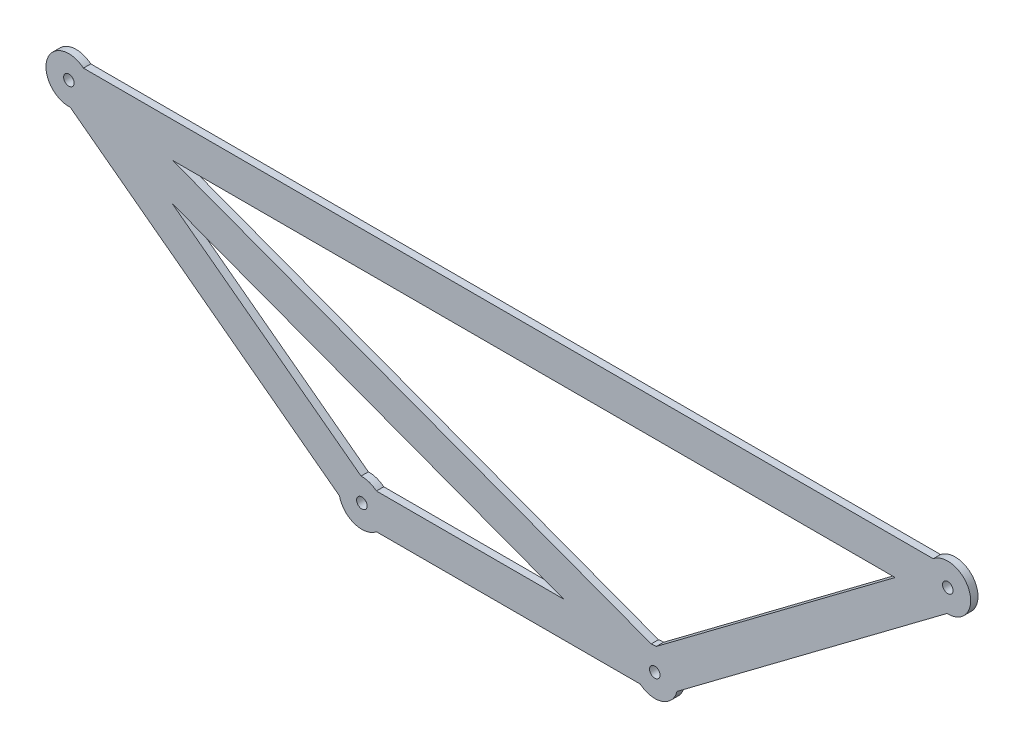
ISO-10303-21;
HEADER;
FILE_DESCRIPTION(('STEP AP214'),'2;1');
FILE_NAME('part.step','',(''),(''),'','','');
FILE_SCHEMA(('AUTOMOTIVE_DESIGN { 1 0 10303 214 1 1 1 1 }'));
ENDSEC;
DATA;
#1=APPLICATION_CONTEXT('core data for automotive mechanical design processes');
#2=APPLICATION_PROTOCOL_DEFINITION('international standard','automotive_design',2000,#1);
#3=PRODUCT_CONTEXT('',#1,'mechanical');
#4=PRODUCT('Part','Part','',(#3));
#5=PRODUCT_RELATED_PRODUCT_CATEGORY('part','',(#4));
#6=PRODUCT_DEFINITION_FORMATION('','',#4);
#7=PRODUCT_DEFINITION_CONTEXT('part definition',#1,'design');
#8=PRODUCT_DEFINITION('design','',#6,#7);
#9=PRODUCT_DEFINITION_SHAPE('','',#8);
#10=(LENGTH_UNIT() NAMED_UNIT(*) SI_UNIT(.MILLI.,.METRE.));
#11=(NAMED_UNIT(*) PLANE_ANGLE_UNIT() SI_UNIT($,.RADIAN.));
#12=(NAMED_UNIT(*) SI_UNIT($,.STERADIAN.) SOLID_ANGLE_UNIT());
#13=UNCERTAINTY_MEASURE_WITH_UNIT(LENGTH_MEASURE(1.E-05),#10,'distance_accuracy_value','');
#14=(GEOMETRIC_REPRESENTATION_CONTEXT(3) GLOBAL_UNCERTAINTY_ASSIGNED_CONTEXT((#13)) GLOBAL_UNIT_ASSIGNED_CONTEXT((#10,
#11,#12)) REPRESENTATION_CONTEXT('',''));
#15=CARTESIAN_POINT('',(0.,0.,0.));
#16=DIRECTION('',(0.,0.,1.));
#17=DIRECTION('',(1.,0.,0.));
#18=AXIS2_PLACEMENT_3D('',#15,#16,#17);
#19=CARTESIAN_POINT('',(0.,0.,0.));
#20=DIRECTION('',(0.,0.,1.));
#21=DIRECTION('',(1.,0.,0.));
#22=AXIS2_PLACEMENT_3D('',#19,#20,#21);
#23=PLANE('',#22);
#24=CARTESIAN_POINT('',(0.,0.,0.));
#25=DIRECTION('',(0.,0.,1.));
#26=DIRECTION('',(1.,0.,0.));
#27=AXIS2_PLACEMENT_3D('',#24,#25,#26);
#28=CIRCLE('',#27,7.18);
#29=CARTESIAN_POINT('',(7.18,0.,0.));
#30=VERTEX_POINT('',#29);
#31=EDGE_CURVE('E539',#30,#30,#28,.T.);
#32=ORIENTED_EDGE('',*,*,#31,.T.);
#33=EDGE_LOOP('',(#32));
#34=FACE_BOUND('',#33,.T.);
#35=CARTESIAN_POINT('',(1200.,0.,0.));
#36=DIRECTION('',(0.,0.,1.));
#37=DIRECTION('',(1.,0.,0.));
#38=AXIS2_PLACEMENT_3D('',#35,#36,#37);
#39=CIRCLE('',#38,7.18000000000006);
#40=CARTESIAN_POINT('',(1207.18,0.,0.));
#41=VERTEX_POINT('',#40);
#42=EDGE_CURVE('E878',#41,#41,#39,.T.);
#43=ORIENTED_EDGE('',*,*,#42,.T.);
#44=EDGE_LOOP('',(#43));
#45=FACE_BOUND('',#44,.T.);
#46=CARTESIAN_POINT('',(800.,-300.,0.));
#47=DIRECTION('',(0.,0.,1.));
#48=DIRECTION('',(1.,0.,0.));
#49=AXIS2_PLACEMENT_3D('',#46,#47,#48);
#50=CIRCLE('',#49,7.17999999999996);
#51=CARTESIAN_POINT('',(807.18,-300.,0.));
#52=VERTEX_POINT('',#51);
#53=EDGE_CURVE('E886',#52,#52,#50,.T.);
#54=ORIENTED_EDGE('',*,*,#53,.T.);
#55=EDGE_LOOP('',(#54));
#56=FACE_BOUND('',#55,.T.);
#57=CARTESIAN_POINT('',(400.,-300.,0.));
#58=DIRECTION('',(0.,0.,1.));
#59=DIRECTION('',(1.,0.,0.));
#60=AXIS2_PLACEMENT_3D('',#57,#58,#59);
#61=CIRCLE('',#60,7.18000000000001);
#62=CARTESIAN_POINT('',(407.18,-300.,0.));
#63=VERTEX_POINT('',#62);
#64=EDGE_CURVE('E590',#63,#63,#61,.T.);
#65=ORIENTED_EDGE('',*,*,#64,.T.);
#66=EDGE_LOOP('',(#65));
#67=FACE_BOUND('',#66,.T.);
#68=CARTESIAN_POINT('',(1200.,0.,0.));
#69=DIRECTION('',(0.,0.,1.));
#70=DIRECTION('',(1.,0.,0.));
#71=AXIS2_PLACEMENT_3D('',#68,#69,#70);
#72=CIRCLE('',#71,31.2600000000001);
#73=CARTESIAN_POINT('',(1198.92175583395,-31.2413986485622,0.));
#74=VERTEX_POINT('',#73);
#75=CARTESIAN_POINT('',(1180.09076596149,24.1,0.));
#76=VERTEX_POINT('',#75);
#77=EDGE_CURVE('E522',#74,#76,#72,.T.);
#78=ORIENTED_EDGE('',*,*,#77,.F.);
#79=DIRECTION('',(-0.8,-0.6,0.));
#80=VECTOR('',#79,1.);
#81=CARTESIAN_POINT('',(1214.60770345153,-19.4769379353759,0.));
#82=LINE('',#81,#80);
#83=CARTESIAN_POINT('',(830.293651069114,-307.71247722219,0.));
#84=VERTEX_POINT('',#83);
#85=EDGE_CURVE('E511',#74,#84,#82,.T.);
#86=ORIENTED_EDGE('',*,*,#85,.T.);
#87=CARTESIAN_POINT('',(800.,-300.,0.));
#88=DIRECTION('',(0.,0.,1.));
#89=DIRECTION('',(1.,0.,0.));
#90=AXIS2_PLACEMENT_3D('',#87,#88,#89);
#91=CIRCLE('',#90,31.26);
#92=CARTESIAN_POINT('',(780.090765961494,-324.1,0.));
#93=VERTEX_POINT('',#92);
#94=EDGE_CURVE('E514',#93,#84,#91,.T.);
#95=ORIENTED_EDGE('',*,*,#94,.F.);
#96=DIRECTION('',(1.,0.,0.));
#97=VECTOR('',#96,1.);
#98=CARTESIAN_POINT('',(400.,-324.1,0.));
#99=LINE('',#98,#97);
#100=CARTESIAN_POINT('',(419.909234038506,-324.1,0.));
#101=VERTEX_POINT('',#100);
#102=EDGE_CURVE('E629',#101,#93,#99,.T.);
#103=ORIENTED_EDGE('',*,*,#102,.F.);
#104=CARTESIAN_POINT('',(400.,-300.,0.));
#105=DIRECTION('',(0.,0.,1.));
#106=DIRECTION('',(1.,0.,0.));
#107=AXIS2_PLACEMENT_3D('',#104,#105,#106);
#108=CIRCLE('',#107,31.26);
#109=CARTESIAN_POINT('',(369.523350744042,-306.954239723312,0.));
#110=VERTEX_POINT('',#109);
#111=EDGE_CURVE('E555',#110,#101,#108,.T.);
#112=ORIENTED_EDGE('',*,*,#111,.F.);
#113=DIRECTION('',(-0.800000000000001,0.599999999999999,0.));
#114=VECTOR('',#113,1.);
#115=CARTESIAN_POINT('',(385.690371200666,-319.07950506578,0.));
#116=LINE('',#115,#114);
#117=CARTESIAN_POINT('',(1.85739165728837,-31.2047704082474,0.));
#118=VERTEX_POINT('',#117);
#119=EDGE_CURVE('E557',#110,#118,#116,.T.);
#120=ORIENTED_EDGE('',*,*,#119,.T.);
#121=CARTESIAN_POINT('',(0.,0.,0.));
#122=DIRECTION('',(0.,0.,1.));
#123=DIRECTION('',(1.,0.,0.));
#124=AXIS2_PLACEMENT_3D('',#121,#122,#123);
#125=CIRCLE('',#124,31.26);
#126=CARTESIAN_POINT('',(19.9092340385058,24.1,0.));
#127=VERTEX_POINT('',#126);
#128=EDGE_CURVE('E579',#127,#118,#125,.T.);
#129=ORIENTED_EDGE('',*,*,#128,.F.);
#130=DIRECTION('',(1.,0.,0.));
#131=VECTOR('',#130,1.);
#132=CARTESIAN_POINT('',(0.,24.1,0.));
#133=LINE('',#132,#131);
#134=EDGE_CURVE('E573',#127,#76,#133,.T.);
#135=ORIENTED_EDGE('',*,*,#134,.T.);
#136=EDGE_LOOP('',(#78,#86,#95,#103,#112,#120,#129,#135));
#137=FACE_BOUND('',#136,.T.);
#138=CARTESIAN_POINT('',(801.850525180355,-268.794821638759,0.));
#139=VERTEX_POINT('',#138);
#140=CARTESIAN_POINT('',(795.029052686113,-269.137769315836,0.));
#141=VERTEX_POINT('',#140);
#142=EDGE_CURVE('E536',#139,#141,#91,.T.);
#143=ORIENTED_EDGE('',*,*,#142,.F.);
#144=DIRECTION('',(-0.8,-0.6,0.));
#145=VECTOR('',#144,1.);
#146=CARTESIAN_POINT('',(1185.68770345153,19.0830620646241,0.));
#147=LINE('',#146,#145);
#148=CARTESIAN_POINT('',(1128.11028736537,-24.1000000000001,0.));
#149=VERTEX_POINT('',#148);
#150=EDGE_CURVE('E533',#149,#139,#147,.T.);
#151=ORIENTED_EDGE('',*,*,#150,.F.);
#152=DIRECTION('',(1.,0.,0.));
#153=VECTOR('',#152,1.);
#154=CARTESIAN_POINT('',(0.,-24.1,0.));
#155=LINE('',#154,#153);
#156=CARTESIAN_POINT('',(141.595001177213,-24.0999999999999,0.));
#157=VERTEX_POINT('',#156);
#158=EDGE_CURVE('E595',#157,#149,#155,.T.);
#159=ORIENTED_EDGE('',*,*,#158,.F.);
#160=DIRECTION('',(-0.936329177569045,0.35112344158839,0.));
#161=VECTOR('',#160,1.);
#162=CARTESIAN_POINT('',(809.533630282123,-274.57698591434,0.));
#163=LINE('',#162,#161);
#164=EDGE_CURVE('E567',#141,#157,#163,.T.);
#165=ORIENTED_EDGE('',*,*,#164,.F.);
#166=EDGE_LOOP('',(#143,#151,#159,#165));
#167=FACE_BOUND('',#166,.T.);
#168=CARTESIAN_POINT('',(419.909234038506,-275.9,0.));
#169=VERTEX_POINT('',#168);
#170=CARTESIAN_POINT('',(398.928841265171,-268.758357614159,0.));
#171=VERTEX_POINT('',#170);
#172=EDGE_CURVE('E619',#169,#171,#108,.T.);
#173=ORIENTED_EDGE('',*,*,#172,.F.);
#174=DIRECTION('',(1.,0.,0.));
#175=VECTOR('',#174,1.);
#176=CARTESIAN_POINT('',(400.,-275.9,0.));
#177=LINE('',#176,#175);
#178=CARTESIAN_POINT('',(675.788007669115,-275.9,0.));
#179=VERTEX_POINT('',#178);
#180=EDGE_CURVE('E547',#169,#179,#177,.T.);
#181=ORIENTED_EDGE('',*,*,#180,.T.);
#182=DIRECTION('',(-0.936329177569045,0.351123441588389,0.));
#183=VECTOR('',#182,1.);
#184=CARTESIAN_POINT('',(792.609480397562,-319.708052273167,0.));
#185=LINE('',#184,#183);
#186=CARTESIAN_POINT('',(141.114054556805,-75.3972675828853,0.));
#187=VERTEX_POINT('',#186);
#188=EDGE_CURVE('E601',#179,#187,#185,.T.);
#189=ORIENTED_EDGE('',*,*,#188,.T.);
#190=DIRECTION('',(-0.800000000000001,0.599999999999999,0.));
#191=VECTOR('',#190,1.);
#192=CARTESIAN_POINT('',(414.610371200665,-280.51950506578,0.));
#193=LINE('',#192,#191);
#194=EDGE_CURVE('E608',#171,#187,#193,.T.);
#195=ORIENTED_EDGE('',*,*,#194,.F.);
#196=EDGE_LOOP('',(#173,#181,#189,#195));
#197=FACE_BOUND('',#196,.T.);
#198=ADVANCED_FACE('F398',(#34,#45,#56,#67,#137,#167,#197),#23,.F.);
#199=CARTESIAN_POINT('',(0.,0.,10.));
#200=DIRECTION('',(0.,0.,1.));
#201=DIRECTION('',(1.,0.,0.));
#202=AXIS2_PLACEMENT_3D('',#199,#200,#201);
#203=PLANE('',#202);
#204=CARTESIAN_POINT('',(0.,0.,10.));
#205=DIRECTION('',(0.,0.,1.));
#206=DIRECTION('',(1.,0.,0.));
#207=AXIS2_PLACEMENT_3D('',#204,#205,#206);
#208=CIRCLE('',#207,7.18);
#209=CARTESIAN_POINT('',(7.18,0.,10.));
#210=VERTEX_POINT('',#209);
#211=EDGE_CURVE('E872',#210,#210,#208,.T.);
#212=ORIENTED_EDGE('',*,*,#211,.F.);
#213=EDGE_LOOP('',(#212));
#214=FACE_BOUND('',#213,.T.);
#215=CARTESIAN_POINT('',(1200.,0.,10.));
#216=DIRECTION('',(0.,0.,1.));
#217=DIRECTION('',(1.,0.,0.));
#218=AXIS2_PLACEMENT_3D('',#215,#216,#217);
#219=CIRCLE('',#218,7.18000000000006);
#220=CARTESIAN_POINT('',(1207.18,0.,10.));
#221=VERTEX_POINT('',#220);
#222=EDGE_CURVE('E874',#221,#221,#219,.T.);
#223=ORIENTED_EDGE('',*,*,#222,.F.);
#224=EDGE_LOOP('',(#223));
#225=FACE_BOUND('',#224,.T.);
#226=CARTESIAN_POINT('',(800.,-300.,10.));
#227=DIRECTION('',(0.,0.,1.));
#228=DIRECTION('',(1.,0.,0.));
#229=AXIS2_PLACEMENT_3D('',#226,#227,#228);
#230=CIRCLE('',#229,7.17999999999996);
#231=CARTESIAN_POINT('',(807.18,-300.,10.));
#232=VERTEX_POINT('',#231);
#233=EDGE_CURVE('E881',#232,#232,#230,.T.);
#234=ORIENTED_EDGE('',*,*,#233,.F.);
#235=EDGE_LOOP('',(#234));
#236=FACE_BOUND('',#235,.T.);
#237=CARTESIAN_POINT('',(400.,-300.,10.));
#238=DIRECTION('',(0.,0.,1.));
#239=DIRECTION('',(1.,0.,0.));
#240=AXIS2_PLACEMENT_3D('',#237,#238,#239);
#241=CIRCLE('',#240,7.18000000000001);
#242=CARTESIAN_POINT('',(407.18,-300.,10.));
#243=VERTEX_POINT('',#242);
#244=EDGE_CURVE('E888',#243,#243,#241,.T.);
#245=ORIENTED_EDGE('',*,*,#244,.F.);
#246=EDGE_LOOP('',(#245));
#247=FACE_BOUND('',#246,.T.);
#248=DIRECTION('',(-0.8,-0.6,0.));
#249=VECTOR('',#248,1.);
#250=CARTESIAN_POINT('',(1214.60770345153,-19.4769379353759,10.));
#251=LINE('',#250,#249);
#252=CARTESIAN_POINT('',(1198.92175583395,-31.2413986485622,10.));
#253=VERTEX_POINT('',#252);
#254=CARTESIAN_POINT('',(830.293651069114,-307.71247722219,10.));
#255=VERTEX_POINT('',#254);
#256=EDGE_CURVE('E512',#253,#255,#251,.T.);
#257=ORIENTED_EDGE('',*,*,#256,.F.);
#258=CARTESIAN_POINT('',(1200.,0.,10.));
#259=DIRECTION('',(0.,0.,1.));
#260=DIRECTION('',(1.,0.,0.));
#261=AXIS2_PLACEMENT_3D('',#258,#259,#260);
#262=CIRCLE('',#261,31.2600000000001);
#263=CARTESIAN_POINT('',(1180.09076596149,24.1,10.));
#264=VERTEX_POINT('',#263);
#265=EDGE_CURVE('E518',#253,#264,#262,.T.);
#266=ORIENTED_EDGE('',*,*,#265,.T.);
#267=DIRECTION('',(1.,0.,0.));
#268=VECTOR('',#267,1.);
#269=CARTESIAN_POINT('',(0.,24.1,10.));
#270=LINE('',#269,#268);
#271=CARTESIAN_POINT('',(19.9092340385058,24.1,10.));
#272=VERTEX_POINT('',#271);
#273=EDGE_CURVE('E587',#272,#264,#270,.T.);
#274=ORIENTED_EDGE('',*,*,#273,.F.);
#275=CARTESIAN_POINT('',(0.,0.,10.));
#276=DIRECTION('',(0.,0.,1.));
#277=DIRECTION('',(1.,0.,0.));
#278=AXIS2_PLACEMENT_3D('',#275,#276,#277);
#279=CIRCLE('',#278,31.26);
#280=CARTESIAN_POINT('',(1.85739165728837,-31.2047704082474,10.));
#281=VERTEX_POINT('',#280);
#282=EDGE_CURVE('E583',#272,#281,#279,.T.);
#283=ORIENTED_EDGE('',*,*,#282,.T.);
#284=DIRECTION('',(-0.800000000000001,0.599999999999999,0.));
#285=VECTOR('',#284,1.);
#286=CARTESIAN_POINT('',(385.690371200666,-319.07950506578,10.));
#287=LINE('',#286,#285);
#288=CARTESIAN_POINT('',(369.523350744042,-306.954239723312,10.));
#289=VERTEX_POINT('',#288);
#290=EDGE_CURVE('E609',#289,#281,#287,.T.);
#291=ORIENTED_EDGE('',*,*,#290,.F.);
#292=CARTESIAN_POINT('',(400.,-300.,10.));
#293=DIRECTION('',(0.,0.,1.));
#294=DIRECTION('',(1.,0.,0.));
#295=AXIS2_PLACEMENT_3D('',#292,#293,#294);
#296=CIRCLE('',#295,31.26);
#297=CARTESIAN_POINT('',(419.909234038506,-324.1,10.));
#298=VERTEX_POINT('',#297);
#299=EDGE_CURVE('E617',#289,#298,#296,.T.);
#300=ORIENTED_EDGE('',*,*,#299,.T.);
#301=DIRECTION('',(1.,0.,0.));
#302=VECTOR('',#301,1.);
#303=CARTESIAN_POINT('',(400.,-324.1,10.));
#304=LINE('',#303,#302);
#305=CARTESIAN_POINT('',(780.090765961494,-324.1,10.));
#306=VERTEX_POINT('',#305);
#307=EDGE_CURVE('E554',#298,#306,#304,.T.);
#308=ORIENTED_EDGE('',*,*,#307,.T.);
#309=CARTESIAN_POINT('',(800.,-300.,10.));
#310=DIRECTION('',(0.,0.,1.));
#311=DIRECTION('',(1.,0.,0.));
#312=AXIS2_PLACEMENT_3D('',#309,#310,#311);
#313=CIRCLE('',#312,31.26);
#314=EDGE_CURVE('E530',#306,#255,#313,.T.);
#315=ORIENTED_EDGE('',*,*,#314,.T.);
#316=EDGE_LOOP('',(#257,#266,#274,#283,#291,#300,#308,#315));
#317=FACE_BOUND('',#316,.T.);
#318=DIRECTION('',(-0.8,-0.6,0.));
#319=VECTOR('',#318,1.);
#320=CARTESIAN_POINT('',(1185.68770345153,19.0830620646241,10.));
#321=LINE('',#320,#319);
#322=CARTESIAN_POINT('',(1128.11028736537,-24.1000000000001,10.));
#323=VERTEX_POINT('',#322);
#324=CARTESIAN_POINT('',(801.850525180355,-268.794821638759,10.));
#325=VERTEX_POINT('',#324);
#326=EDGE_CURVE('E513',#323,#325,#321,.T.);
#327=ORIENTED_EDGE('',*,*,#326,.T.);
#328=CARTESIAN_POINT('',(795.029052686113,-269.137769315836,10.));
#329=VERTEX_POINT('',#328);
#330=EDGE_CURVE('E546',#325,#329,#313,.T.);
#331=ORIENTED_EDGE('',*,*,#330,.T.);
#332=DIRECTION('',(-0.936329177569045,0.35112344158839,0.));
#333=VECTOR('',#332,1.);
#334=CARTESIAN_POINT('',(809.533630282123,-274.57698591434,10.));
#335=LINE('',#334,#333);
#336=CARTESIAN_POINT('',(141.595001177213,-24.0999999999999,10.));
#337=VERTEX_POINT('',#336);
#338=EDGE_CURVE('E598',#329,#337,#335,.T.);
#339=ORIENTED_EDGE('',*,*,#338,.T.);
#340=DIRECTION('',(1.,0.,0.));
#341=VECTOR('',#340,1.);
#342=CARTESIAN_POINT('',(0.,-24.1,10.));
#343=LINE('',#342,#341);
#344=EDGE_CURVE('E576',#337,#323,#343,.T.);
#345=ORIENTED_EDGE('',*,*,#344,.T.);
#346=EDGE_LOOP('',(#327,#331,#339,#345));
#347=FACE_BOUND('',#346,.T.);
#348=DIRECTION('',(1.,0.,0.));
#349=VECTOR('',#348,1.);
#350=CARTESIAN_POINT('',(400.,-275.9,10.));
#351=LINE('',#350,#349);
#352=CARTESIAN_POINT('',(419.909234038506,-275.9,10.));
#353=VERTEX_POINT('',#352);
#354=CARTESIAN_POINT('',(675.788007669115,-275.9,10.));
#355=VERTEX_POINT('',#354);
#356=EDGE_CURVE('E621',#353,#355,#351,.T.);
#357=ORIENTED_EDGE('',*,*,#356,.F.);
#358=CARTESIAN_POINT('',(398.928841265171,-268.758357614159,10.));
#359=VERTEX_POINT('',#358);
#360=EDGE_CURVE('E556',#353,#359,#296,.T.);
#361=ORIENTED_EDGE('',*,*,#360,.T.);
#362=DIRECTION('',(-0.800000000000001,0.599999999999999,0.));
#363=VECTOR('',#362,1.);
#364=CARTESIAN_POINT('',(414.610371200665,-280.51950506578,10.));
#365=LINE('',#364,#363);
#366=CARTESIAN_POINT('',(141.114054556805,-75.3972675828853,10.));
#367=VERTEX_POINT('',#366);
#368=EDGE_CURVE('E562',#359,#367,#365,.T.);
#369=ORIENTED_EDGE('',*,*,#368,.T.);
#370=DIRECTION('',(-0.936329177569045,0.351123441588389,0.));
#371=VECTOR('',#370,1.);
#372=CARTESIAN_POINT('',(792.609480397562,-319.708052273167,10.));
#373=LINE('',#372,#371);
#374=EDGE_CURVE('E571',#355,#367,#373,.T.);
#375=ORIENTED_EDGE('',*,*,#374,.F.);
#376=EDGE_LOOP('',(#357,#361,#369,#375));
#377=FACE_BOUND('',#376,.T.);
#378=ADVANCED_FACE('F528',(#214,#225,#236,#247,#317,#347,#377),#203,.T.);
#379=CARTESIAN_POINT('',(0.,0.,10.));
#380=DIRECTION('',(0.,0.,-1.));
#381=DIRECTION('',(-1.,0.,0.));
#382=AXIS2_PLACEMENT_3D('',#379,#380,#381);
#383=CYLINDRICAL_SURFACE('',#382,31.26);
#384=ORIENTED_EDGE('',*,*,#282,.F.);
#385=DIRECTION('',(0.,0.,-1.));
#386=VECTOR('',#385,1.);
#387=CARTESIAN_POINT('',(19.9092340385058,24.1,10.));
#388=LINE('',#387,#386);
#389=EDGE_CURVE('E12',#272,#127,#388,.T.);
#390=ORIENTED_EDGE('',*,*,#389,.T.);
#391=ORIENTED_EDGE('',*,*,#128,.T.);
#392=DIRECTION('',(0.,0.,-1.));
#393=VECTOR('',#392,1.);
#394=CARTESIAN_POINT('',(1.85739165728845,-31.2047704082474,10.));
#395=LINE('',#394,#393);
#396=EDGE_CURVE('E403',#118,#281,#395,.F.);
#397=ORIENTED_EDGE('',*,*,#396,.T.);
#398=EDGE_LOOP('',(#384,#390,#391,#397));
#399=FACE_BOUND('',#398,.T.);
#400=ADVANCED_FACE('F647',(#399),#383,.T.);
#401=CARTESIAN_POINT('',(800.,-300.,10.));
#402=DIRECTION('',(0.,0.,-1.));
#403=DIRECTION('',(-1.,0.,0.));
#404=AXIS2_PLACEMENT_3D('',#401,#402,#403);
#405=CYLINDRICAL_SURFACE('',#404,31.26);
#406=ORIENTED_EDGE('',*,*,#314,.F.);
#407=DIRECTION('',(0.,0.,-1.));
#408=VECTOR('',#407,1.);
#409=CARTESIAN_POINT('',(780.090765961494,-324.1,10.));
#410=LINE('',#409,#408);
#411=EDGE_CURVE('E548',#306,#93,#410,.T.);
#412=ORIENTED_EDGE('',*,*,#411,.T.);
#413=ORIENTED_EDGE('',*,*,#94,.T.);
#414=DIRECTION('',(0.,0.,-1.));
#415=VECTOR('',#414,1.);
#416=CARTESIAN_POINT('',(830.293651069114,-307.71247722219,10.));
#417=LINE('',#416,#415);
#418=EDGE_CURVE('E544',#84,#255,#417,.F.);
#419=ORIENTED_EDGE('',*,*,#418,.T.);
#420=EDGE_LOOP('',(#406,#412,#413,#419));
#421=FACE_BOUND('',#420,.T.);
#422=ADVANCED_FACE('F639',(#421),#405,.T.);
#423=ORIENTED_EDGE('',*,*,#142,.T.);
#424=DIRECTION('',(0.,0.,-1.));
#425=VECTOR('',#424,1.);
#426=CARTESIAN_POINT('',(795.029052686113,-269.137769315836,10.));
#427=LINE('',#426,#425);
#428=EDGE_CURVE('E568',#141,#329,#427,.F.);
#429=ORIENTED_EDGE('',*,*,#428,.T.);
#430=ORIENTED_EDGE('',*,*,#330,.F.);
#431=DIRECTION('',(0.,0.,-1.));
#432=VECTOR('',#431,1.);
#433=CARTESIAN_POINT('',(801.850525180355,-268.794821638759,10.));
#434=LINE('',#433,#432);
#435=EDGE_CURVE('E545',#139,#325,#434,.F.);
#436=ORIENTED_EDGE('',*,*,#435,.F.);
#437=EDGE_LOOP('',(#423,#429,#430,#436));
#438=FACE_BOUND('',#437,.T.);
#439=ADVANCED_FACE('F678',(#438),#405,.T.);
#440=CARTESIAN_POINT('',(400.,-275.9,10.));
#441=DIRECTION('',(0.,1.,0.));
#442=DIRECTION('',(0.,0.,1.));
#443=AXIS2_PLACEMENT_3D('',#440,#441,#442);
#444=PLANE('',#443);
#445=ORIENTED_EDGE('',*,*,#356,.T.);
#446=DIRECTION('',(0.,0.,-1.));
#447=VECTOR('',#446,1.);
#448=CARTESIAN_POINT('',(675.788007669115,-275.9,10.));
#449=LINE('',#448,#447);
#450=EDGE_CURVE('E570',#355,#179,#449,.T.);
#451=ORIENTED_EDGE('',*,*,#450,.T.);
#452=ORIENTED_EDGE('',*,*,#180,.F.);
#453=DIRECTION('',(0.,0.,-1.));
#454=VECTOR('',#453,1.);
#455=CARTESIAN_POINT('',(419.909234038506,-275.9,10.));
#456=LINE('',#455,#454);
#457=EDGE_CURVE('E551',#353,#169,#456,.T.);
#458=ORIENTED_EDGE('',*,*,#457,.F.);
#459=EDGE_LOOP('',(#445,#451,#452,#458));
#460=FACE_BOUND('',#459,.T.);
#461=ADVANCED_FACE('F675',(#460),#444,.T.);
#462=CARTESIAN_POINT('',(1214.60770345153,-19.4769379353759,10.));
#463=DIRECTION('',(0.6,-0.8,0.));
#464=DIRECTION('',(0.8,0.6,0.));
#465=AXIS2_PLACEMENT_3D('',#462,#463,#464);
#466=PLANE('',#465);
#467=ORIENTED_EDGE('',*,*,#418,.F.);
#468=ORIENTED_EDGE('',*,*,#85,.F.);
#469=DIRECTION('',(0.,0.,-1.));
#470=VECTOR('',#469,1.);
#471=CARTESIAN_POINT('',(1198.92175583395,-31.2413986485623,10.));
#472=LINE('',#471,#470);
#473=EDGE_CURVE('E505',#74,#253,#472,.F.);
#474=ORIENTED_EDGE('',*,*,#473,.T.);
#475=ORIENTED_EDGE('',*,*,#256,.T.);
#476=EDGE_LOOP('',(#467,#468,#474,#475));
#477=FACE_BOUND('',#476,.T.);
#478=ADVANCED_FACE('F507',(#477),#466,.T.);
#479=CARTESIAN_POINT('',(400.,-324.1,10.));
#480=DIRECTION('',(0.,1.,0.));
#481=DIRECTION('',(0.,0.,1.));
#482=AXIS2_PLACEMENT_3D('',#479,#480,#481);
#483=PLANE('',#482);
#484=ORIENTED_EDGE('',*,*,#307,.F.);
#485=DIRECTION('',(0.,0.,-1.));
#486=VECTOR('',#485,1.);
#487=CARTESIAN_POINT('',(419.909234038506,-324.1,10.));
#488=LINE('',#487,#486);
#489=EDGE_CURVE('E559',#298,#101,#488,.T.);
#490=ORIENTED_EDGE('',*,*,#489,.T.);
#491=ORIENTED_EDGE('',*,*,#102,.T.);
#492=ORIENTED_EDGE('',*,*,#411,.F.);
#493=EDGE_LOOP('',(#484,#490,#491,#492));
#494=FACE_BOUND('',#493,.T.);
#495=ADVANCED_FACE('F662',(#494),#483,.F.);
#496=CARTESIAN_POINT('',(1185.68770345153,19.0830620646241,10.));
#497=DIRECTION('',(0.6,-0.8,0.));
#498=DIRECTION('',(0.8,0.6,0.));
#499=AXIS2_PLACEMENT_3D('',#496,#497,#498);
#500=PLANE('',#499);
#501=ORIENTED_EDGE('',*,*,#326,.F.);
#502=DIRECTION('',(0.,0.,-1.));
#503=VECTOR('',#502,1.);
#504=CARTESIAN_POINT('',(1128.11028736537,-24.1,10.));
#505=LINE('',#504,#503);
#506=EDGE_CURVE('E572',#323,#149,#505,.T.);
#507=ORIENTED_EDGE('',*,*,#506,.T.);
#508=ORIENTED_EDGE('',*,*,#150,.T.);
#509=ORIENTED_EDGE('',*,*,#435,.T.);
#510=EDGE_LOOP('',(#501,#507,#508,#509));
#511=FACE_BOUND('',#510,.T.);
#512=ADVANCED_FACE('F664',(#511),#500,.F.);
#513=CARTESIAN_POINT('',(809.533630282123,-274.57698591434,10.));
#514=DIRECTION('',(-0.35112344158839,-0.936329177569045,0.));
#515=DIRECTION('',(0.936329177569045,-0.35112344158839,0.));
#516=AXIS2_PLACEMENT_3D('',#513,#514,#515);
#517=PLANE('',#516);
#518=ORIENTED_EDGE('',*,*,#164,.T.);
#519=DIRECTION('',(0.,0.,1.));
#520=VECTOR('',#519,1.);
#521=CARTESIAN_POINT('',(141.595001177213,-24.1,10.));
#522=LINE('',#521,#520);
#523=EDGE_CURVE('E580',#157,#337,#522,.T.);
#524=ORIENTED_EDGE('',*,*,#523,.T.);
#525=ORIENTED_EDGE('',*,*,#338,.F.);
#526=ORIENTED_EDGE('',*,*,#428,.F.);
#527=EDGE_LOOP('',(#518,#524,#525,#526));
#528=FACE_BOUND('',#527,.T.);
#529=ADVANCED_FACE('F668',(#528),#517,.F.);
#530=CARTESIAN_POINT('',(400.,-300.,10.));
#531=DIRECTION('',(0.,0.,-1.));
#532=DIRECTION('',(-1.,0.,0.));
#533=AXIS2_PLACEMENT_3D('',#530,#531,#532);
#534=CYLINDRICAL_SURFACE('',#533,31.26);
#535=ORIENTED_EDGE('',*,*,#172,.T.);
#536=DIRECTION('',(0.,0.,-1.));
#537=VECTOR('',#536,1.);
#538=CARTESIAN_POINT('',(398.928841265171,-268.758357614159,10.));
#539=LINE('',#538,#537);
#540=EDGE_CURVE('E563',#171,#359,#539,.F.);
#541=ORIENTED_EDGE('',*,*,#540,.T.);
#542=ORIENTED_EDGE('',*,*,#360,.F.);
#543=ORIENTED_EDGE('',*,*,#457,.T.);
#544=EDGE_LOOP('',(#535,#541,#542,#543));
#545=FACE_BOUND('',#544,.T.);
#546=ADVANCED_FACE('F700',(#545),#534,.T.);
#547=CARTESIAN_POINT('',(792.609480397562,-319.708052273167,10.));
#548=DIRECTION('',(-0.351123441588389,-0.936329177569045,0.));
#549=DIRECTION('',(0.936329177569045,-0.351123441588389,0.));
#550=AXIS2_PLACEMENT_3D('',#547,#548,#549);
#551=PLANE('',#550);
#552=ORIENTED_EDGE('',*,*,#374,.T.);
#553=DIRECTION('',(0.,0.,-1.));
#554=VECTOR('',#553,1.);
#555=CARTESIAN_POINT('',(141.114054556806,-75.3972675828858,10.));
#556=LINE('',#555,#554);
#557=EDGE_CURVE('E569',#367,#187,#556,.T.);
#558=ORIENTED_EDGE('',*,*,#557,.T.);
#559=ORIENTED_EDGE('',*,*,#188,.F.);
#560=ORIENTED_EDGE('',*,*,#450,.F.);
#561=EDGE_LOOP('',(#552,#558,#559,#560));
#562=FACE_BOUND('',#561,.T.);
#563=ADVANCED_FACE('F695',(#562),#551,.T.);
#564=CARTESIAN_POINT('',(1200.,0.,10.));
#565=DIRECTION('',(0.,0.,-1.));
#566=DIRECTION('',(-1.,0.,0.));
#567=AXIS2_PLACEMENT_3D('',#564,#565,#566);
#568=CYLINDRICAL_SURFACE('',#567,31.2600000000001);
#569=DIRECTION('',(0.,0.,-1.));
#570=VECTOR('',#569,1.);
#571=CARTESIAN_POINT('',(1180.09076596149,24.1,10.));
#572=LINE('',#571,#570);
#573=EDGE_CURVE('E523',#264,#76,#572,.T.);
#574=ORIENTED_EDGE('',*,*,#573,.F.);
#575=ORIENTED_EDGE('',*,*,#265,.F.);
#576=ORIENTED_EDGE('',*,*,#473,.F.);
#577=ORIENTED_EDGE('',*,*,#77,.T.);
#578=EDGE_LOOP('',(#574,#575,#576,#577));
#579=FACE_BOUND('',#578,.T.);
#580=ADVANCED_FACE('F396',(#579),#568,.T.);
#581=DIRECTION('',(0.,0.,-1.));
#582=VECTOR('',#581,1.);
#583=CARTESIAN_POINT('',(369.523350744042,-306.954239723312,10.));
#584=LINE('',#583,#582);
#585=EDGE_CURVE('E561',#110,#289,#584,.F.);
#586=ORIENTED_EDGE('',*,*,#585,.F.);
#587=ORIENTED_EDGE('',*,*,#111,.T.);
#588=ORIENTED_EDGE('',*,*,#489,.F.);
#589=ORIENTED_EDGE('',*,*,#299,.F.);
#590=EDGE_LOOP('',(#586,#587,#588,#589));
#591=FACE_BOUND('',#590,.T.);
#592=ADVANCED_FACE('F660',(#591),#534,.T.);
#593=CARTESIAN_POINT('',(414.610371200665,-280.51950506578,10.));
#594=DIRECTION('',(-0.599999999999999,-0.800000000000001,0.));
#595=DIRECTION('',(0.800000000000001,-0.599999999999999,0.));
#596=AXIS2_PLACEMENT_3D('',#593,#594,#595);
#597=PLANE('',#596);
#598=ORIENTED_EDGE('',*,*,#557,.F.);
#599=ORIENTED_EDGE('',*,*,#368,.F.);
#600=ORIENTED_EDGE('',*,*,#540,.F.);
#601=ORIENTED_EDGE('',*,*,#194,.T.);
#602=EDGE_LOOP('',(#598,#599,#600,#601));
#603=FACE_BOUND('',#602,.T.);
#604=ADVANCED_FACE('F705',(#603),#597,.F.);
#605=CARTESIAN_POINT('',(385.690371200666,-319.07950506578,10.));
#606=DIRECTION('',(-0.599999999999999,-0.8,0.));
#607=DIRECTION('',(0.8,-0.599999999999999,0.));
#608=AXIS2_PLACEMENT_3D('',#605,#606,#607);
#609=PLANE('',#608);
#610=ORIENTED_EDGE('',*,*,#396,.F.);
#611=ORIENTED_EDGE('',*,*,#119,.F.);
#612=ORIENTED_EDGE('',*,*,#585,.T.);
#613=ORIENTED_EDGE('',*,*,#290,.T.);
#614=EDGE_LOOP('',(#610,#611,#612,#613));
#615=FACE_BOUND('',#614,.T.);
#616=ADVANCED_FACE('F653',(#615),#609,.T.);
#617=CARTESIAN_POINT('',(0.,-24.1,10.));
#618=DIRECTION('',(0.,1.,0.));
#619=DIRECTION('',(0.,0.,1.));
#620=AXIS2_PLACEMENT_3D('',#617,#618,#619);
#621=PLANE('',#620);
#622=ORIENTED_EDGE('',*,*,#523,.F.);
#623=ORIENTED_EDGE('',*,*,#158,.T.);
#624=ORIENTED_EDGE('',*,*,#506,.F.);
#625=ORIENTED_EDGE('',*,*,#344,.F.);
#626=EDGE_LOOP('',(#622,#623,#624,#625));
#627=FACE_BOUND('',#626,.T.);
#628=ADVANCED_FACE('F686',(#627),#621,.F.);
#629=CARTESIAN_POINT('',(0.,24.1,10.));
#630=DIRECTION('',(0.,1.,0.));
#631=DIRECTION('',(0.,0.,1.));
#632=AXIS2_PLACEMENT_3D('',#629,#630,#631);
#633=PLANE('',#632);
#634=ORIENTED_EDGE('',*,*,#389,.F.);
#635=ORIENTED_EDGE('',*,*,#273,.T.);
#636=ORIENTED_EDGE('',*,*,#573,.T.);
#637=ORIENTED_EDGE('',*,*,#134,.F.);
#638=EDGE_LOOP('',(#634,#635,#636,#637));
#639=FACE_BOUND('',#638,.T.);
#640=ADVANCED_FACE('F648',(#639),#633,.T.);
#641=CARTESIAN_POINT('',(400.,-300.,0.));
#642=DIRECTION('',(0.,0.,1.));
#643=DIRECTION('',(1.,0.,0.));
#644=AXIS2_PLACEMENT_3D('',#641,#642,#643);
#645=CYLINDRICAL_SURFACE('',#644,7.18000000000001);
#646=ORIENTED_EDGE('',*,*,#64,.F.);
#647=EDGE_LOOP('',(#646));
#648=FACE_BOUND('',#647,.T.);
#649=ORIENTED_EDGE('',*,*,#244,.T.);
#650=EDGE_LOOP('',(#649));
#651=FACE_BOUND('',#650,.T.);
#652=ADVANCED_FACE('F682',(#648,#651),#645,.F.);
#653=CARTESIAN_POINT('',(800.,-300.,0.));
#654=DIRECTION('',(0.,0.,1.));
#655=DIRECTION('',(1.,0.,0.));
#656=AXIS2_PLACEMENT_3D('',#653,#654,#655);
#657=CYLINDRICAL_SURFACE('',#656,7.17999999999996);
#658=ORIENTED_EDGE('',*,*,#53,.F.);
#659=EDGE_LOOP('',(#658));
#660=FACE_BOUND('',#659,.T.);
#661=ORIENTED_EDGE('',*,*,#233,.T.);
#662=EDGE_LOOP('',(#661));
#663=FACE_BOUND('',#662,.T.);
#664=ADVANCED_FACE('F832',(#660,#663),#657,.F.);
#665=CARTESIAN_POINT('',(1200.,0.,0.));
#666=DIRECTION('',(0.,0.,1.));
#667=DIRECTION('',(1.,0.,0.));
#668=AXIS2_PLACEMENT_3D('',#665,#666,#667);
#669=CYLINDRICAL_SURFACE('',#668,7.18000000000006);
#670=ORIENTED_EDGE('',*,*,#42,.F.);
#671=EDGE_LOOP('',(#670));
#672=FACE_BOUND('',#671,.T.);
#673=ORIENTED_EDGE('',*,*,#222,.T.);
#674=EDGE_LOOP('',(#673));
#675=FACE_BOUND('',#674,.T.);
#676=ADVANCED_FACE('F844',(#672,#675),#669,.F.);
#677=CARTESIAN_POINT('',(0.,0.,0.));
#678=DIRECTION('',(0.,0.,1.));
#679=DIRECTION('',(1.,0.,0.));
#680=AXIS2_PLACEMENT_3D('',#677,#678,#679);
#681=CYLINDRICAL_SURFACE('',#680,7.18);
#682=ORIENTED_EDGE('',*,*,#31,.F.);
#683=EDGE_LOOP('',(#682));
#684=FACE_BOUND('',#683,.T.);
#685=ORIENTED_EDGE('',*,*,#211,.T.);
#686=EDGE_LOOP('',(#685));
#687=FACE_BOUND('',#686,.T.);
#688=ADVANCED_FACE('F851',(#684,#687),#681,.F.);
#689=CLOSED_SHELL('',(#198,#378,#400,#422,#439,#461,#478,#495,#512,#529,#546,#563,#580,#592,
#604,#616,#628,#640,#652,#664,#676,#688));
#690=MANIFOLD_SOLID_BREP('B2',#689);
#691=ADVANCED_BREP_SHAPE_REPRESENTATION('',(#18,#690),#14);
#692=SHAPE_DEFINITION_REPRESENTATION(#9,#691);
ENDSEC;
END-ISO-10303-21;
